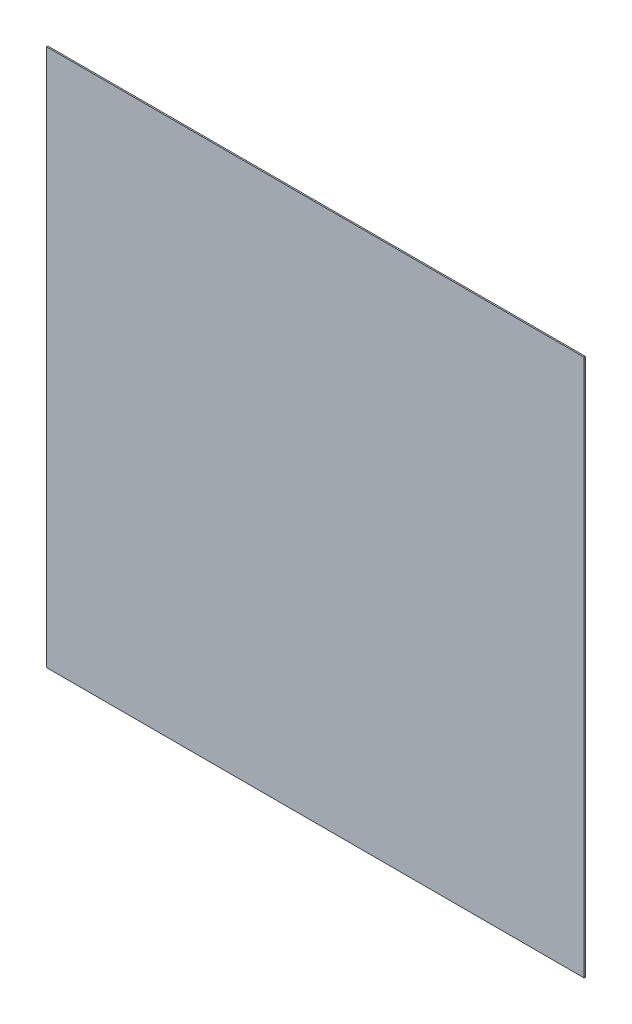
ISO-10303-21;
HEADER;
FILE_DESCRIPTION(('STEP AP214'),'2;1');
FILE_NAME('part.step','',(''),(''),'','','');
FILE_SCHEMA(('AUTOMOTIVE_DESIGN { 1 0 10303 214 1 1 1 1 }'));
ENDSEC;
DATA;
#1=APPLICATION_CONTEXT('core data for automotive mechanical design processes');
#2=APPLICATION_PROTOCOL_DEFINITION('international standard','automotive_design',2000,#1);
#3=PRODUCT_CONTEXT('',#1,'mechanical');
#4=PRODUCT('Part','Part','',(#3));
#5=PRODUCT_RELATED_PRODUCT_CATEGORY('part','',(#4));
#6=PRODUCT_DEFINITION_FORMATION('','',#4);
#7=PRODUCT_DEFINITION_CONTEXT('part definition',#1,'design');
#8=PRODUCT_DEFINITION('design','',#6,#7);
#9=PRODUCT_DEFINITION_SHAPE('','',#8);
#10=(LENGTH_UNIT() NAMED_UNIT(*) SI_UNIT(.MILLI.,.METRE.));
#11=(NAMED_UNIT(*) PLANE_ANGLE_UNIT() SI_UNIT($,.RADIAN.));
#12=(NAMED_UNIT(*) SI_UNIT($,.STERADIAN.) SOLID_ANGLE_UNIT());
#13=UNCERTAINTY_MEASURE_WITH_UNIT(LENGTH_MEASURE(1.E-05),#10,'distance_accuracy_value','');
#14=(GEOMETRIC_REPRESENTATION_CONTEXT(3) GLOBAL_UNCERTAINTY_ASSIGNED_CONTEXT((#13)) GLOBAL_UNIT_ASSIGNED_CONTEXT((#10,
#11,#12)) REPRESENTATION_CONTEXT('',''));
#15=CARTESIAN_POINT('',(0.,0.,0.));
#16=DIRECTION('',(0.,0.,1.));
#17=DIRECTION('',(1.,0.,0.));
#18=AXIS2_PLACEMENT_3D('',#15,#16,#17);
#19=CARTESIAN_POINT('',(25.4,25.4,0.127));
#20=DIRECTION('',(-1.,0.,0.));
#21=DIRECTION('',(0.,-1.,0.));
#22=AXIS2_PLACEMENT_3D('',#19,#20,#21);
#23=PLANE('',#22);
#24=DIRECTION('',(0.,1.,0.));
#25=VECTOR('',#24,1.);
#26=CARTESIAN_POINT('',(25.4,25.4,0.));
#27=LINE('',#26,#25);
#28=CARTESIAN_POINT('',(25.4,-25.4,0.));
#29=VERTEX_POINT('',#28);
#30=CARTESIAN_POINT('',(25.4,25.4,0.));
#31=VERTEX_POINT('',#30);
#32=EDGE_CURVE('E96',#29,#31,#27,.T.);
#33=ORIENTED_EDGE('',*,*,#32,.T.);
#34=DIRECTION('',(0.,0.,-1.));
#35=VECTOR('',#34,1.);
#36=CARTESIAN_POINT('',(25.4,25.4,0.127));
#37=LINE('',#36,#35);
#38=CARTESIAN_POINT('',(25.4,25.4,0.127));
#39=VERTEX_POINT('',#38);
#40=EDGE_CURVE('E11',#39,#31,#37,.T.);
#41=ORIENTED_EDGE('',*,*,#40,.F.);
#42=DIRECTION('',(0.,1.,0.));
#43=VECTOR('',#42,1.);
#44=CARTESIAN_POINT('',(25.4,25.4,0.127));
#45=LINE('',#44,#43);
#46=CARTESIAN_POINT('',(25.4,-25.4,0.127));
#47=VERTEX_POINT('',#46);
#48=EDGE_CURVE('E84',#47,#39,#45,.T.);
#49=ORIENTED_EDGE('',*,*,#48,.F.);
#50=DIRECTION('',(0.,0.,-1.));
#51=VECTOR('',#50,1.);
#52=CARTESIAN_POINT('',(25.4,-25.4,0.127));
#53=LINE('',#52,#51);
#54=EDGE_CURVE('E92',#47,#29,#53,.T.);
#55=ORIENTED_EDGE('',*,*,#54,.T.);
#56=EDGE_LOOP('',(#33,#41,#49,#55));
#57=FACE_BOUND('',#56,.T.);
#58=ADVANCED_FACE('F33',(#57),#23,.F.);
#59=CARTESIAN_POINT('',(-25.4,25.4,0.127));
#60=DIRECTION('',(0.,-1.,0.));
#61=DIRECTION('',(0.,0.,-1.));
#62=AXIS2_PLACEMENT_3D('',#59,#60,#61);
#63=PLANE('',#62);
#64=DIRECTION('',(-1.,0.,0.));
#65=VECTOR('',#64,1.);
#66=CARTESIAN_POINT('',(-25.4,25.4,0.));
#67=LINE('',#66,#65);
#68=CARTESIAN_POINT('',(-25.4,25.4,0.));
#69=VERTEX_POINT('',#68);
#70=EDGE_CURVE('E88',#31,#69,#67,.T.);
#71=ORIENTED_EDGE('',*,*,#70,.T.);
#72=DIRECTION('',(0.,0.,-1.));
#73=VECTOR('',#72,1.);
#74=CARTESIAN_POINT('',(-25.4,25.4,0.127));
#75=LINE('',#74,#73);
#76=CARTESIAN_POINT('',(-25.4,25.4,0.127));
#77=VERTEX_POINT('',#76);
#78=EDGE_CURVE('E41',#77,#69,#75,.T.);
#79=ORIENTED_EDGE('',*,*,#78,.F.);
#80=DIRECTION('',(-1.,0.,0.));
#81=VECTOR('',#80,1.);
#82=CARTESIAN_POINT('',(-25.4,25.4,0.127));
#83=LINE('',#82,#81);
#84=EDGE_CURVE('E79',#39,#77,#83,.T.);
#85=ORIENTED_EDGE('',*,*,#84,.F.);
#86=ORIENTED_EDGE('',*,*,#40,.T.);
#87=EDGE_LOOP('',(#71,#79,#85,#86));
#88=FACE_BOUND('',#87,.T.);
#89=ADVANCED_FACE('F87',(#88),#63,.F.);
#90=CARTESIAN_POINT('',(-25.4,25.4,0.127));
#91=DIRECTION('',(1.,0.,0.));
#92=DIRECTION('',(0.,1.,0.));
#93=AXIS2_PLACEMENT_3D('',#90,#91,#92);
#94=PLANE('',#93);
#95=DIRECTION('',(0.,-1.,0.));
#96=VECTOR('',#95,1.);
#97=CARTESIAN_POINT('',(-25.4,25.4,0.));
#98=LINE('',#97,#96);
#99=CARTESIAN_POINT('',(-25.4,-25.4,0.));
#100=VERTEX_POINT('',#99);
#101=EDGE_CURVE('E66',#69,#100,#98,.T.);
#102=ORIENTED_EDGE('',*,*,#101,.T.);
#103=DIRECTION('',(0.,0.,-1.));
#104=VECTOR('',#103,1.);
#105=CARTESIAN_POINT('',(-25.4,-25.4,0.127));
#106=LINE('',#105,#104);
#107=CARTESIAN_POINT('',(-25.4,-25.4,0.127));
#108=VERTEX_POINT('',#107);
#109=EDGE_CURVE('E89',#108,#100,#106,.T.);
#110=ORIENTED_EDGE('',*,*,#109,.F.);
#111=DIRECTION('',(0.,-1.,0.));
#112=VECTOR('',#111,1.);
#113=CARTESIAN_POINT('',(-25.4,25.4,0.127));
#114=LINE('',#113,#112);
#115=EDGE_CURVE('E82',#77,#108,#114,.T.);
#116=ORIENTED_EDGE('',*,*,#115,.F.);
#117=ORIENTED_EDGE('',*,*,#78,.T.);
#118=EDGE_LOOP('',(#102,#110,#116,#117));
#119=FACE_BOUND('',#118,.T.);
#120=ADVANCED_FACE('F90',(#119),#94,.F.);
#121=CARTESIAN_POINT('',(-25.4,-25.4,0.127));
#122=DIRECTION('',(0.,1.,0.));
#123=DIRECTION('',(0.,0.,1.));
#124=AXIS2_PLACEMENT_3D('',#121,#122,#123);
#125=PLANE('',#124);
#126=DIRECTION('',(1.,0.,0.));
#127=VECTOR('',#126,1.);
#128=CARTESIAN_POINT('',(-25.4,-25.4,0.));
#129=LINE('',#128,#127);
#130=EDGE_CURVE('E72',#100,#29,#129,.T.);
#131=ORIENTED_EDGE('',*,*,#130,.T.);
#132=ORIENTED_EDGE('',*,*,#54,.F.);
#133=DIRECTION('',(1.,0.,0.));
#134=VECTOR('',#133,1.);
#135=CARTESIAN_POINT('',(-25.4,-25.4,0.127));
#136=LINE('',#135,#134);
#137=EDGE_CURVE('E49',#108,#47,#136,.T.);
#138=ORIENTED_EDGE('',*,*,#137,.F.);
#139=ORIENTED_EDGE('',*,*,#109,.T.);
#140=EDGE_LOOP('',(#131,#132,#138,#139));
#141=FACE_BOUND('',#140,.T.);
#142=ADVANCED_FACE('F103',(#141),#125,.F.);
#143=CARTESIAN_POINT('',(0.,0.,0.127));
#144=DIRECTION('',(0.,0.,1.));
#145=DIRECTION('',(1.,0.,0.));
#146=AXIS2_PLACEMENT_3D('',#143,#144,#145);
#147=PLANE('',#146);
#148=ORIENTED_EDGE('',*,*,#48,.T.);
#149=ORIENTED_EDGE('',*,*,#84,.T.);
#150=ORIENTED_EDGE('',*,*,#115,.T.);
#151=ORIENTED_EDGE('',*,*,#137,.T.);
#152=EDGE_LOOP('',(#148,#149,#150,#151));
#153=FACE_BOUND('',#152,.T.);
#154=ADVANCED_FACE('F80',(#153),#147,.T.);
#155=CARTESIAN_POINT('',(0.,0.,0.));
#156=DIRECTION('',(0.,0.,1.));
#157=DIRECTION('',(1.,0.,0.));
#158=AXIS2_PLACEMENT_3D('',#155,#156,#157);
#159=PLANE('',#158);
#160=ORIENTED_EDGE('',*,*,#32,.F.);
#161=ORIENTED_EDGE('',*,*,#130,.F.);
#162=ORIENTED_EDGE('',*,*,#101,.F.);
#163=ORIENTED_EDGE('',*,*,#70,.F.);
#164=EDGE_LOOP('',(#160,#161,#162,#163));
#165=FACE_BOUND('',#164,.T.);
#166=ADVANCED_FACE('F106',(#165),#159,.F.);
#167=CLOSED_SHELL('',(#58,#89,#120,#142,#154,#166));
#168=MANIFOLD_SOLID_BREP('B2',#167);
#169=ADVANCED_BREP_SHAPE_REPRESENTATION('',(#18,#168),#14);
#170=SHAPE_DEFINITION_REPRESENTATION(#9,#169);
ENDSEC;
END-ISO-10303-21;
